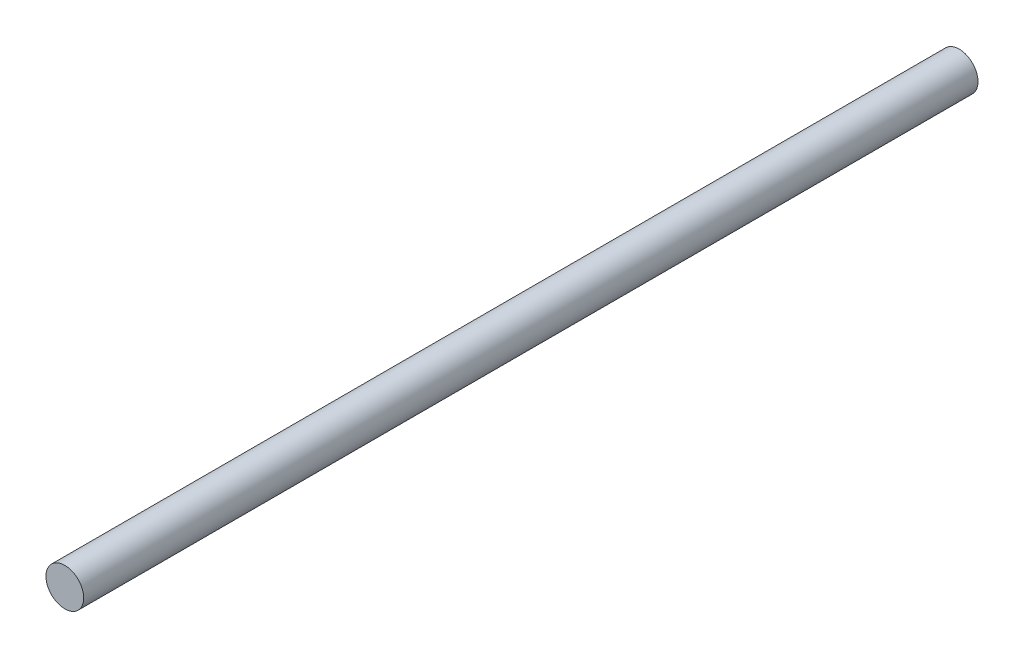
ISO-10303-21;
HEADER;
FILE_DESCRIPTION(('STEP AP214'),'2;1');
FILE_NAME('part.step','',(''),(''),'','','');
FILE_SCHEMA(('AUTOMOTIVE_DESIGN { 1 0 10303 214 1 1 1 1 }'));
ENDSEC;
DATA;
#1=APPLICATION_CONTEXT('core data for automotive mechanical design processes');
#2=APPLICATION_PROTOCOL_DEFINITION('international standard','automotive_design',2000,#1);
#3=PRODUCT_CONTEXT('',#1,'mechanical');
#4=PRODUCT('Part','Part','',(#3));
#5=PRODUCT_RELATED_PRODUCT_CATEGORY('part','',(#4));
#6=PRODUCT_DEFINITION_FORMATION('','',#4);
#7=PRODUCT_DEFINITION_CONTEXT('part definition',#1,'design');
#8=PRODUCT_DEFINITION('design','',#6,#7);
#9=PRODUCT_DEFINITION_SHAPE('','',#8);
#10=(LENGTH_UNIT() NAMED_UNIT(*) SI_UNIT(.MILLI.,.METRE.));
#11=(NAMED_UNIT(*) PLANE_ANGLE_UNIT() SI_UNIT($,.RADIAN.));
#12=(NAMED_UNIT(*) SI_UNIT($,.STERADIAN.) SOLID_ANGLE_UNIT());
#13=UNCERTAINTY_MEASURE_WITH_UNIT(LENGTH_MEASURE(1.E-05),#10,'distance_accuracy_value','');
#14=(GEOMETRIC_REPRESENTATION_CONTEXT(3) GLOBAL_UNCERTAINTY_ASSIGNED_CONTEXT((#13)) GLOBAL_UNIT_ASSIGNED_CONTEXT((#10,
#11,#12)) REPRESENTATION_CONTEXT('',''));
#15=CARTESIAN_POINT('',(0.,0.,0.));
#16=DIRECTION('',(0.,0.,1.));
#17=DIRECTION('',(1.,0.,0.));
#18=AXIS2_PLACEMENT_3D('',#15,#16,#17);
#19=CARTESIAN_POINT('',(0.,0.,237.));
#20=DIRECTION('',(0.,0.,-1.));
#21=DIRECTION('',(-1.,0.,0.));
#22=AXIS2_PLACEMENT_3D('',#19,#20,#21);
#23=CYLINDRICAL_SURFACE('',#22,5.);
#24=CARTESIAN_POINT('',(0.,0.,237.));
#25=DIRECTION('',(0.,0.,1.));
#26=DIRECTION('',(1.,0.,0.));
#27=AXIS2_PLACEMENT_3D('',#24,#25,#26);
#28=CIRCLE('',#27,5.);
#29=CARTESIAN_POINT('',(5.,0.,237.));
#30=VERTEX_POINT('',#29);
#31=EDGE_CURVE('E10',#30,#30,#28,.T.);
#32=ORIENTED_EDGE('',*,*,#31,.F.);
#33=EDGE_LOOP('',(#32));
#34=FACE_BOUND('',#33,.T.);
#35=CARTESIAN_POINT('',(0.,0.,0.));
#36=DIRECTION('',(0.,0.,1.));
#37=DIRECTION('',(1.,0.,0.));
#38=AXIS2_PLACEMENT_3D('',#35,#36,#37);
#39=CIRCLE('',#38,5.);
#40=CARTESIAN_POINT('',(5.,0.,0.));
#41=VERTEX_POINT('',#40);
#42=EDGE_CURVE('E33',#41,#41,#39,.T.);
#43=ORIENTED_EDGE('',*,*,#42,.T.);
#44=EDGE_LOOP('',(#43));
#45=FACE_BOUND('',#44,.T.);
#46=ADVANCED_FACE('F30',(#34,#45),#23,.T.);
#47=CARTESIAN_POINT('',(0.,0.,237.));
#48=DIRECTION('',(0.,0.,1.));
#49=DIRECTION('',(1.,0.,0.));
#50=AXIS2_PLACEMENT_3D('',#47,#48,#49);
#51=PLANE('',#50);
#52=ORIENTED_EDGE('',*,*,#31,.T.);
#53=EDGE_LOOP('',(#52));
#54=FACE_BOUND('',#53,.T.);
#55=ADVANCED_FACE('F45',(#54),#51,.T.);
#56=CARTESIAN_POINT('',(0.,0.,0.));
#57=DIRECTION('',(0.,0.,1.));
#58=DIRECTION('',(1.,0.,0.));
#59=AXIS2_PLACEMENT_3D('',#56,#57,#58);
#60=PLANE('',#59);
#61=ORIENTED_EDGE('',*,*,#42,.F.);
#62=EDGE_LOOP('',(#61));
#63=FACE_BOUND('',#62,.T.);
#64=ADVANCED_FACE('F43',(#63),#60,.F.);
#65=CLOSED_SHELL('',(#46,#55,#64));
#66=MANIFOLD_SOLID_BREP('B2',#65);
#67=ADVANCED_BREP_SHAPE_REPRESENTATION('',(#18,#66),#14);
#68=SHAPE_DEFINITION_REPRESENTATION(#9,#67);
ENDSEC;
END-ISO-10303-21;
